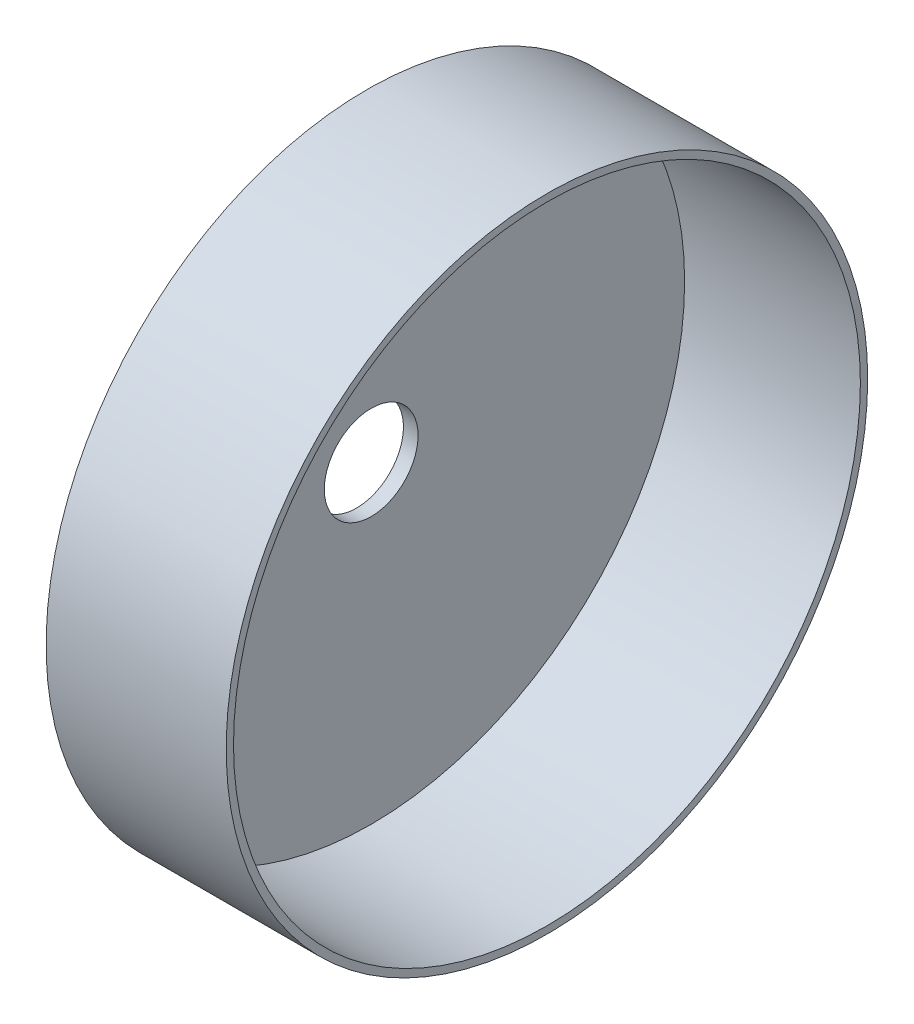
ISO-10303-21;
HEADER;
FILE_DESCRIPTION(('STEP AP214'),'2;1');
FILE_NAME('part.step','',(''),(''),'','','');
FILE_SCHEMA(('AUTOMOTIVE_DESIGN { 1 0 10303 214 1 1 1 1 }'));
ENDSEC;
DATA;
#1=APPLICATION_CONTEXT('core data for automotive mechanical design processes');
#2=APPLICATION_PROTOCOL_DEFINITION('international standard','automotive_design',2000,#1);
#3=PRODUCT_CONTEXT('',#1,'mechanical');
#4=PRODUCT('Part','Part','',(#3));
#5=PRODUCT_RELATED_PRODUCT_CATEGORY('part','',(#4));
#6=PRODUCT_DEFINITION_FORMATION('','',#4);
#7=PRODUCT_DEFINITION_CONTEXT('part definition',#1,'design');
#8=PRODUCT_DEFINITION('design','',#6,#7);
#9=PRODUCT_DEFINITION_SHAPE('','',#8);
#10=(LENGTH_UNIT() NAMED_UNIT(*) SI_UNIT(.MILLI.,.METRE.));
#11=(NAMED_UNIT(*) PLANE_ANGLE_UNIT() SI_UNIT($,.RADIAN.));
#12=(NAMED_UNIT(*) SI_UNIT($,.STERADIAN.) SOLID_ANGLE_UNIT());
#13=UNCERTAINTY_MEASURE_WITH_UNIT(LENGTH_MEASURE(1.E-05),#10,'distance_accuracy_value','');
#14=(GEOMETRIC_REPRESENTATION_CONTEXT(3) GLOBAL_UNCERTAINTY_ASSIGNED_CONTEXT((#13)) GLOBAL_UNIT_ASSIGNED_CONTEXT((#10,
#11,#12)) REPRESENTATION_CONTEXT('',''));
#15=CARTESIAN_POINT('',(0.,0.,0.));
#16=DIRECTION('',(0.,0.,1.));
#17=DIRECTION('',(1.,0.,0.));
#18=AXIS2_PLACEMENT_3D('',#15,#16,#17);
#19=CARTESIAN_POINT('',(1.,0.,0.));
#20=DIRECTION('',(-1.,0.,0.));
#21=DIRECTION('',(0.,0.,1.));
#22=AXIS2_PLACEMENT_3D('',#19,#20,#21);
#23=CYLINDRICAL_SURFACE('',#22,21.9);
#24=CARTESIAN_POINT('',(0.705307922833862,0.,0.));
#25=DIRECTION('',(1.,0.,0.));
#26=DIRECTION('',(0.,0.,-1.));
#27=AXIS2_PLACEMENT_3D('',#24,#25,#26);
#28=CIRCLE('',#27,21.9);
#29=CARTESIAN_POINT('',(0.705307922833862,0.,-21.9));
#30=VERTEX_POINT('',#29);
#31=EDGE_CURVE('E50',#30,#30,#28,.T.);
#32=ORIENTED_EDGE('',*,*,#31,.T.);
#33=EDGE_LOOP('',(#32));
#34=FACE_BOUND('',#33,.T.);
#35=CARTESIAN_POINT('',(13.,0.,0.));
#36=DIRECTION('',(1.,0.,0.));
#37=DIRECTION('',(0.,0.,-1.));
#38=AXIS2_PLACEMENT_3D('',#35,#36,#37);
#39=CIRCLE('',#38,21.9);
#40=CARTESIAN_POINT('',(13.,0.,-21.9));
#41=VERTEX_POINT('',#40);
#42=EDGE_CURVE('E54',#41,#41,#39,.T.);
#43=ORIENTED_EDGE('',*,*,#42,.F.);
#44=EDGE_LOOP('',(#43));
#45=FACE_BOUND('',#44,.T.);
#46=ADVANCED_FACE('F39',(#34,#45),#23,.T.);
#47=CARTESIAN_POINT('',(0.,0.,0.));
#48=DIRECTION('',(1.,0.,0.));
#49=DIRECTION('',(0.,0.,-1.));
#50=AXIS2_PLACEMENT_3D('',#47,#48,#49);
#51=PLANE('',#50);
#52=CARTESIAN_POINT('',(0.,0.,0.));
#53=DIRECTION('',(1.,0.,0.));
#54=DIRECTION('',(0.,0.,-1.));
#55=AXIS2_PLACEMENT_3D('',#52,#53,#54);
#56=CIRCLE('',#55,17.8999999999999);
#57=CARTESIAN_POINT('',(0.,0.,-17.8999999999999));
#58=VERTEX_POINT('',#57);
#59=EDGE_CURVE('E10',#58,#58,#56,.F.);
#60=ORIENTED_EDGE('',*,*,#59,.T.);
#61=EDGE_LOOP('',(#60));
#62=FACE_BOUND('',#61,.T.);
#63=CARTESIAN_POINT('',(0.,0.,0.));
#64=DIRECTION('',(-1.,0.,0.));
#65=DIRECTION('',(0.,0.,1.));
#66=AXIS2_PLACEMENT_3D('',#63,#64,#65);
#67=CIRCLE('',#66,3.2);
#68=CARTESIAN_POINT('',(0.,0.,3.2));
#69=VERTEX_POINT('',#68);
#70=EDGE_CURVE('E62',#69,#69,#67,.T.);
#71=ORIENTED_EDGE('',*,*,#70,.F.);
#72=EDGE_LOOP('',(#71));
#73=FACE_BOUND('',#72,.T.);
#74=ADVANCED_FACE('F72',(#62,#73),#51,.F.);
#75=CARTESIAN_POINT('',(13.,0.,0.));
#76=DIRECTION('',(1.,0.,0.));
#77=DIRECTION('',(0.,0.,-1.));
#78=AXIS2_PLACEMENT_3D('',#75,#76,#77);
#79=PLANE('',#78);
#80=ORIENTED_EDGE('',*,*,#42,.T.);
#81=EDGE_LOOP('',(#80));
#82=FACE_BOUND('',#81,.T.);
#83=CARTESIAN_POINT('',(13.,0.,0.));
#84=DIRECTION('',(1.,0.,0.));
#85=DIRECTION('',(0.,0.,-1.));
#86=AXIS2_PLACEMENT_3D('',#83,#84,#85);
#87=CIRCLE('',#86,21.4);
#88=CARTESIAN_POINT('',(13.,0.,-21.4));
#89=VERTEX_POINT('',#88);
#90=EDGE_CURVE('E58',#89,#89,#87,.T.);
#91=ORIENTED_EDGE('',*,*,#90,.F.);
#92=EDGE_LOOP('',(#91));
#93=FACE_BOUND('',#92,.T.);
#94=ADVANCED_FACE('F73',(#82,#93),#79,.T.);
#95=CARTESIAN_POINT('',(13.,0.,0.));
#96=DIRECTION('',(-1.,0.,0.));
#97=DIRECTION('',(0.,0.,1.));
#98=AXIS2_PLACEMENT_3D('',#95,#96,#97);
#99=CYLINDRICAL_SURFACE('',#98,21.4);
#100=ORIENTED_EDGE('',*,*,#90,.T.);
#101=EDGE_LOOP('',(#100));
#102=FACE_BOUND('',#101,.T.);
#103=CARTESIAN_POINT('',(1.,0.,0.));
#104=DIRECTION('',(1.,0.,0.));
#105=DIRECTION('',(0.,0.,-1.));
#106=AXIS2_PLACEMENT_3D('',#103,#104,#105);
#107=CIRCLE('',#106,21.4);
#108=CARTESIAN_POINT('',(1.,0.,-21.4));
#109=VERTEX_POINT('',#108);
#110=EDGE_CURVE('E51',#109,#109,#107,.F.);
#111=ORIENTED_EDGE('',*,*,#110,.T.);
#112=EDGE_LOOP('',(#111));
#113=FACE_BOUND('',#112,.T.);
#114=ADVANCED_FACE('F82',(#102,#113),#99,.F.);
#115=CARTESIAN_POINT('',(1.,0.,0.));
#116=DIRECTION('',(1.,0.,0.));
#117=DIRECTION('',(0.,0.,-1.));
#118=AXIS2_PLACEMENT_3D('',#115,#116,#117);
#119=PLANE('',#118);
#120=CARTESIAN_POINT('',(1.,0.,0.));
#121=DIRECTION('',(1.,0.,0.));
#122=DIRECTION('',(0.,0.,-1.));
#123=AXIS2_PLACEMENT_3D('',#120,#121,#122);
#124=CIRCLE('',#123,3.2);
#125=CARTESIAN_POINT('',(1.,0.,-3.2));
#126=VERTEX_POINT('',#125);
#127=EDGE_CURVE('E59',#126,#126,#124,.T.);
#128=ORIENTED_EDGE('',*,*,#127,.F.);
#129=EDGE_LOOP('',(#128));
#130=FACE_BOUND('',#129,.T.);
#131=ORIENTED_EDGE('',*,*,#110,.F.);
#132=EDGE_LOOP('',(#131));
#133=FACE_BOUND('',#132,.T.);
#134=ADVANCED_FACE('F83',(#130,#133),#119,.T.);
#135=CARTESIAN_POINT('',(12.,0.,0.));
#136=DIRECTION('',(-1.,0.,0.));
#137=DIRECTION('',(0.,0.,1.));
#138=AXIS2_PLACEMENT_3D('',#135,#136,#137);
#139=CYLINDRICAL_SURFACE('',#138,3.2);
#140=ORIENTED_EDGE('',*,*,#127,.T.);
#141=EDGE_LOOP('',(#140));
#142=FACE_BOUND('',#141,.T.);
#143=ORIENTED_EDGE('',*,*,#70,.T.);
#144=EDGE_LOOP('',(#143));
#145=FACE_BOUND('',#144,.T.);
#146=ADVANCED_FACE('F68',(#142,#145),#139,.F.);
#147=CARTESIAN_POINT('',(0.705307922833862,0.,0.));
#148=DIRECTION('',(1.,0.,0.));
#149=DIRECTION('',(0.,0.,-1.));
#150=AXIS2_PLACEMENT_3D('',#147,#148,#149);
#151=CONICAL_SURFACE('',#150,21.9,1.39626340159547);
#152=ORIENTED_EDGE('',*,*,#59,.F.);
#153=EDGE_LOOP('',(#152));
#154=FACE_BOUND('',#153,.T.);
#155=ORIENTED_EDGE('',*,*,#31,.F.);
#156=EDGE_LOOP('',(#155));
#157=FACE_BOUND('',#156,.T.);
#158=ADVANCED_FACE('F45',(#154,#157),#151,.T.);
#159=CLOSED_SHELL('',(#46,#74,#94,#114,#134,#146,#158));
#160=MANIFOLD_SOLID_BREP('B2',#159);
#161=ADVANCED_BREP_SHAPE_REPRESENTATION('',(#18,#160),#14);
#162=SHAPE_DEFINITION_REPRESENTATION(#9,#161);
ENDSEC;
END-ISO-10303-21;
